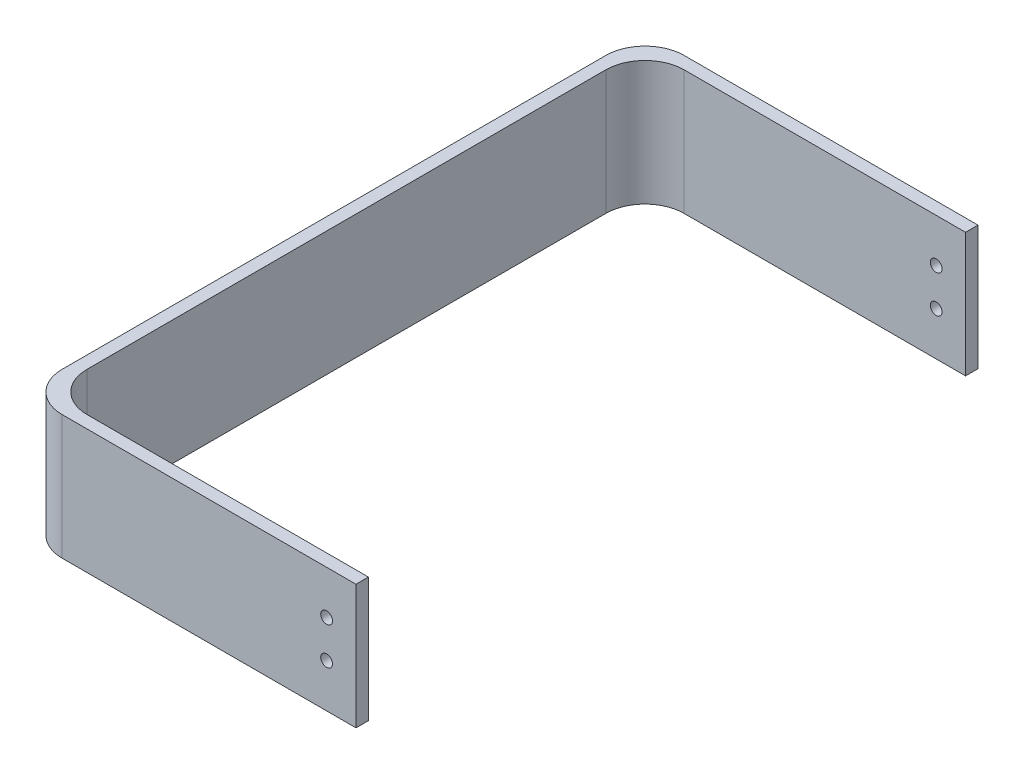
ISO-10303-21;
HEADER;
FILE_DESCRIPTION(('STEP AP214'),'2;1');
FILE_NAME('part.step','',(''),(''),'','','');
FILE_SCHEMA(('AUTOMOTIVE_DESIGN { 1 0 10303 214 1 1 1 1 }'));
ENDSEC;
DATA;
#1=APPLICATION_CONTEXT('core data for automotive mechanical design processes');
#2=APPLICATION_PROTOCOL_DEFINITION('international standard','automotive_design',2000,#1);
#3=PRODUCT_CONTEXT('',#1,'mechanical');
#4=PRODUCT('Part','Part','',(#3));
#5=PRODUCT_RELATED_PRODUCT_CATEGORY('part','',(#4));
#6=PRODUCT_DEFINITION_FORMATION('','',#4);
#7=PRODUCT_DEFINITION_CONTEXT('part definition',#1,'design');
#8=PRODUCT_DEFINITION('design','',#6,#7);
#9=PRODUCT_DEFINITION_SHAPE('','',#8);
#10=(LENGTH_UNIT() NAMED_UNIT(*) SI_UNIT(.MILLI.,.METRE.));
#11=(NAMED_UNIT(*) PLANE_ANGLE_UNIT() SI_UNIT($,.RADIAN.));
#12=(NAMED_UNIT(*) SI_UNIT($,.STERADIAN.) SOLID_ANGLE_UNIT());
#13=UNCERTAINTY_MEASURE_WITH_UNIT(LENGTH_MEASURE(1.E-05),#10,'distance_accuracy_value','');
#14=(GEOMETRIC_REPRESENTATION_CONTEXT(3) GLOBAL_UNCERTAINTY_ASSIGNED_CONTEXT((#13)) GLOBAL_UNIT_ASSIGNED_CONTEXT((#10,
#11,#12)) REPRESENTATION_CONTEXT('',''));
#15=CARTESIAN_POINT('',(0.,0.,0.));
#16=DIRECTION('',(0.,0.,1.));
#17=DIRECTION('',(1.,0.,0.));
#18=AXIS2_PLACEMENT_3D('',#15,#16,#17);
#19=CARTESIAN_POINT('',(0.,31.75,-3.175));
#20=DIRECTION('',(-1.,0.,0.));
#21=DIRECTION('',(0.,0.,1.));
#22=AXIS2_PLACEMENT_3D('',#19,#20,#21);
#23=PLANE('',#22);
#24=DIRECTION('',(0.,0.,-1.));
#25=VECTOR('',#24,1.);
#26=CARTESIAN_POINT('',(0.,0.,-3.175));
#27=LINE('',#26,#25);
#28=CARTESIAN_POINT('',(0.,0.,0.));
#29=VERTEX_POINT('',#28);
#30=CARTESIAN_POINT('',(0.,0.,-3.175));
#31=VERTEX_POINT('',#30);
#32=EDGE_CURVE('E160',#29,#31,#27,.T.);
#33=ORIENTED_EDGE('',*,*,#32,.T.);
#34=DIRECTION('',(0.,-1.,0.));
#35=VECTOR('',#34,1.);
#36=CARTESIAN_POINT('',(0.,31.75,-3.175));
#37=LINE('',#36,#35);
#38=CARTESIAN_POINT('',(0.,31.75,-3.175));
#39=VERTEX_POINT('',#38);
#40=EDGE_CURVE('E141',#39,#31,#37,.T.);
#41=ORIENTED_EDGE('',*,*,#40,.F.);
#42=DIRECTION('',(0.,0.,-1.));
#43=VECTOR('',#42,1.);
#44=CARTESIAN_POINT('',(0.,31.75,-3.175));
#45=LINE('',#44,#43);
#46=CARTESIAN_POINT('',(0.,31.75,0.));
#47=VERTEX_POINT('',#46);
#48=EDGE_CURVE('E148',#47,#39,#45,.T.);
#49=ORIENTED_EDGE('',*,*,#48,.F.);
#50=DIRECTION('',(0.,-1.,0.));
#51=VECTOR('',#50,1.);
#52=CARTESIAN_POINT('',(0.,31.75,0.));
#53=LINE('',#52,#51);
#54=EDGE_CURVE('E257',#47,#29,#53,.T.);
#55=ORIENTED_EDGE('',*,*,#54,.T.);
#56=EDGE_LOOP('',(#33,#41,#49,#55));
#57=FACE_BOUND('',#56,.T.);
#58=ADVANCED_FACE('F44',(#57),#23,.F.);
#59=CARTESIAN_POINT('',(0.,31.75,-3.175));
#60=DIRECTION('',(0.,0.,1.));
#61=DIRECTION('',(1.,0.,0.));
#62=AXIS2_PLACEMENT_3D('',#59,#60,#61);
#63=PLANE('',#62);
#64=CARTESIAN_POINT('',(-7.49999999999999,11.1125,-3.17500000000001));
#65=DIRECTION('',(0.,0.,1.));
#66=DIRECTION('',(1.,0.,0.));
#67=AXIS2_PLACEMENT_3D('',#64,#65,#66);
#68=CIRCLE('',#67,1.5);
#69=CARTESIAN_POINT('',(-5.99999999999999,11.1125,-3.17500000000001));
#70=VERTEX_POINT('',#69);
#71=EDGE_CURVE('E260',#70,#70,#68,.T.);
#72=ORIENTED_EDGE('',*,*,#71,.T.);
#73=EDGE_LOOP('',(#72));
#74=FACE_BOUND('',#73,.T.);
#75=CARTESIAN_POINT('',(-7.49999999999999,20.6375,-3.17500000000001));
#76=DIRECTION('',(0.,0.,1.));
#77=DIRECTION('',(1.,0.,0.));
#78=AXIS2_PLACEMENT_3D('',#75,#76,#77);
#79=CIRCLE('',#78,1.5);
#80=CARTESIAN_POINT('',(-5.99999999999999,20.6375,-3.17500000000001));
#81=VERTEX_POINT('',#80);
#82=EDGE_CURVE('E359',#81,#81,#79,.T.);
#83=ORIENTED_EDGE('',*,*,#82,.T.);
#84=EDGE_LOOP('',(#83));
#85=FACE_BOUND('',#84,.T.);
#86=DIRECTION('',(-1.,0.,0.));
#87=VECTOR('',#86,1.);
#88=CARTESIAN_POINT('',(0.,0.,-3.175));
#89=LINE('',#88,#87);
#90=CARTESIAN_POINT('',(-71.825,0.,-3.17499999999999));
#91=VERTEX_POINT('',#90);
#92=EDGE_CURVE('E231',#31,#91,#89,.T.);
#93=ORIENTED_EDGE('',*,*,#92,.T.);
#94=DIRECTION('',(0.,-1.,0.));
#95=VECTOR('',#94,1.);
#96=CARTESIAN_POINT('',(-71.825,31.75,-3.17499999999999));
#97=LINE('',#96,#95);
#98=CARTESIAN_POINT('',(-71.825,31.75,-3.17499999999999));
#99=VERTEX_POINT('',#98);
#100=EDGE_CURVE('E144',#91,#99,#97,.F.);
#101=ORIENTED_EDGE('',*,*,#100,.T.);
#102=DIRECTION('',(-1.,0.,0.));
#103=VECTOR('',#102,1.);
#104=CARTESIAN_POINT('',(0.,31.75,-3.175));
#105=LINE('',#104,#103);
#106=EDGE_CURVE('E136',#39,#99,#105,.T.);
#107=ORIENTED_EDGE('',*,*,#106,.F.);
#108=ORIENTED_EDGE('',*,*,#40,.T.);
#109=EDGE_LOOP('',(#93,#101,#107,#108));
#110=FACE_BOUND('',#109,.T.);
#111=ADVANCED_FACE('F139',(#74,#85,#110),#63,.F.);
#112=CARTESIAN_POINT('',(-81.825,31.75,-3.17499999999999));
#113=DIRECTION('',(-1.,0.,0.));
#114=DIRECTION('',(0.,0.,1.));
#115=AXIS2_PLACEMENT_3D('',#112,#113,#114);
#116=PLANE('',#115);
#117=DIRECTION('',(0.,0.,-1.));
#118=VECTOR('',#117,1.);
#119=CARTESIAN_POINT('',(-81.825,31.75,-3.17499999999999));
#120=LINE('',#119,#118);
#121=CARTESIAN_POINT('',(-81.825,31.75,-13.175));
#122=VERTEX_POINT('',#121);
#123=CARTESIAN_POINT('',(-81.825,31.75,-145.575));
#124=VERTEX_POINT('',#123);
#125=EDGE_CURVE('E147',#122,#124,#120,.T.);
#126=ORIENTED_EDGE('',*,*,#125,.F.);
#127=DIRECTION('',(0.,-1.,0.));
#128=VECTOR('',#127,1.);
#129=CARTESIAN_POINT('',(-81.825,0.,-13.175));
#130=LINE('',#129,#128);
#131=CARTESIAN_POINT('',(-81.825,0.,-13.175));
#132=VERTEX_POINT('',#131);
#133=EDGE_CURVE('E167',#122,#132,#130,.T.);
#134=ORIENTED_EDGE('',*,*,#133,.T.);
#135=DIRECTION('',(0.,0.,-1.));
#136=VECTOR('',#135,1.);
#137=CARTESIAN_POINT('',(-81.825,0.,-3.17499999999999));
#138=LINE('',#137,#136);
#139=CARTESIAN_POINT('',(-81.825,0.,-145.575));
#140=VERTEX_POINT('',#139);
#141=EDGE_CURVE('E219',#132,#140,#138,.T.);
#142=ORIENTED_EDGE('',*,*,#141,.T.);
#143=DIRECTION('',(0.,-1.,0.));
#144=VECTOR('',#143,1.);
#145=CARTESIAN_POINT('',(-81.825,31.75,-145.575));
#146=LINE('',#145,#144);
#147=EDGE_CURVE('E162',#140,#124,#146,.F.);
#148=ORIENTED_EDGE('',*,*,#147,.T.);
#149=EDGE_LOOP('',(#126,#134,#142,#148));
#150=FACE_BOUND('',#149,.T.);
#151=ADVANCED_FACE('F227',(#150),#116,.F.);
#152=CARTESIAN_POINT('',(-81.825,31.75,-155.575));
#153=DIRECTION('',(0.,0.,-1.));
#154=DIRECTION('',(-1.,0.,0.));
#155=AXIS2_PLACEMENT_3D('',#152,#153,#154);
#156=PLANE('',#155);
#157=CARTESIAN_POINT('',(-7.49999999999999,11.1125,-155.575));
#158=DIRECTION('',(0.,0.,-1.));
#159=DIRECTION('',(-1.,0.,0.));
#160=AXIS2_PLACEMENT_3D('',#157,#158,#159);
#161=CIRCLE('',#160,1.5);
#162=CARTESIAN_POINT('',(-5.99999999999999,11.1125,-155.575));
#163=VERTEX_POINT('',#162);
#164=EDGE_CURVE('E355',#163,#163,#161,.T.);
#165=ORIENTED_EDGE('',*,*,#164,.T.);
#166=EDGE_LOOP('',(#165));
#167=FACE_BOUND('',#166,.T.);
#168=CARTESIAN_POINT('',(-7.49999999999999,20.6375,-155.575));
#169=DIRECTION('',(0.,0.,-1.));
#170=DIRECTION('',(-1.,0.,0.));
#171=AXIS2_PLACEMENT_3D('',#168,#169,#170);
#172=CIRCLE('',#171,1.5);
#173=CARTESIAN_POINT('',(-5.99999999999999,20.6375,-155.575));
#174=VERTEX_POINT('',#173);
#175=EDGE_CURVE('E365',#174,#174,#172,.T.);
#176=ORIENTED_EDGE('',*,*,#175,.T.);
#177=EDGE_LOOP('',(#176));
#178=FACE_BOUND('',#177,.T.);
#179=DIRECTION('',(1.,0.,0.));
#180=VECTOR('',#179,1.);
#181=CARTESIAN_POINT('',(-81.825,31.75,-155.575));
#182=LINE('',#181,#180);
#183=CARTESIAN_POINT('',(-71.825,31.75,-155.575));
#184=VERTEX_POINT('',#183);
#185=CARTESIAN_POINT('',(0.,31.75,-155.575));
#186=VERTEX_POINT('',#185);
#187=EDGE_CURVE('E236',#184,#186,#182,.T.);
#188=ORIENTED_EDGE('',*,*,#187,.F.);
#189=DIRECTION('',(0.,-1.,0.));
#190=VECTOR('',#189,1.);
#191=CARTESIAN_POINT('',(-71.825,0.,-155.575));
#192=LINE('',#191,#190);
#193=CARTESIAN_POINT('',(-71.825,0.,-155.575));
#194=VERTEX_POINT('',#193);
#195=EDGE_CURVE('E179',#184,#194,#192,.T.);
#196=ORIENTED_EDGE('',*,*,#195,.T.);
#197=DIRECTION('',(1.,0.,0.));
#198=VECTOR('',#197,1.);
#199=CARTESIAN_POINT('',(-81.825,0.,-155.575));
#200=LINE('',#199,#198);
#201=CARTESIAN_POINT('',(0.,0.,-155.575));
#202=VERTEX_POINT('',#201);
#203=EDGE_CURVE('E221',#194,#202,#200,.T.);
#204=ORIENTED_EDGE('',*,*,#203,.T.);
#205=DIRECTION('',(0.,-1.,0.));
#206=VECTOR('',#205,1.);
#207=CARTESIAN_POINT('',(0.,31.75,-155.575));
#208=LINE('',#207,#206);
#209=EDGE_CURVE('E163',#186,#202,#208,.T.);
#210=ORIENTED_EDGE('',*,*,#209,.F.);
#211=EDGE_LOOP('',(#188,#196,#204,#210));
#212=FACE_BOUND('',#211,.T.);
#213=ADVANCED_FACE('F239',(#167,#178,#212),#156,.F.);
#214=CARTESIAN_POINT('',(0.,31.75,-158.75));
#215=DIRECTION('',(-1.,0.,0.));
#216=DIRECTION('',(0.,0.,1.));
#217=AXIS2_PLACEMENT_3D('',#214,#215,#216);
#218=PLANE('',#217);
#219=DIRECTION('',(0.,0.,-1.));
#220=VECTOR('',#219,1.);
#221=CARTESIAN_POINT('',(0.,0.,-158.75));
#222=LINE('',#221,#220);
#223=CARTESIAN_POINT('',(0.,0.,-158.75));
#224=VERTEX_POINT('',#223);
#225=EDGE_CURVE('E265',#202,#224,#222,.T.);
#226=ORIENTED_EDGE('',*,*,#225,.T.);
#227=DIRECTION('',(0.,-1.,0.));
#228=VECTOR('',#227,1.);
#229=CARTESIAN_POINT('',(0.,31.75,-158.75));
#230=LINE('',#229,#228);
#231=CARTESIAN_POINT('',(0.,31.75,-158.75));
#232=VERTEX_POINT('',#231);
#233=EDGE_CURVE('E170',#232,#224,#230,.T.);
#234=ORIENTED_EDGE('',*,*,#233,.F.);
#235=DIRECTION('',(0.,0.,-1.));
#236=VECTOR('',#235,1.);
#237=CARTESIAN_POINT('',(0.,31.75,-158.75));
#238=LINE('',#237,#236);
#239=EDGE_CURVE('E242',#186,#232,#238,.T.);
#240=ORIENTED_EDGE('',*,*,#239,.F.);
#241=ORIENTED_EDGE('',*,*,#209,.T.);
#242=EDGE_LOOP('',(#226,#234,#240,#241));
#243=FACE_BOUND('',#242,.T.);
#244=ADVANCED_FACE('F325',(#243),#218,.F.);
#245=CARTESIAN_POINT('',(-85.,31.75,-158.75));
#246=DIRECTION('',(0.,0.,1.));
#247=DIRECTION('',(1.,0.,0.));
#248=AXIS2_PLACEMENT_3D('',#245,#246,#247);
#249=PLANE('',#248);
#250=CARTESIAN_POINT('',(-7.49999999999999,11.1125,-158.75));
#251=DIRECTION('',(0.,0.,1.));
#252=DIRECTION('',(1.,0.,0.));
#253=AXIS2_PLACEMENT_3D('',#250,#251,#252);
#254=CIRCLE('',#253,1.5);
#255=CARTESIAN_POINT('',(-5.99999999999999,11.1125,-158.75));
#256=VERTEX_POINT('',#255);
#257=EDGE_CURVE('E369',#256,#256,#254,.T.);
#258=ORIENTED_EDGE('',*,*,#257,.T.);
#259=EDGE_LOOP('',(#258));
#260=FACE_BOUND('',#259,.T.);
#261=CARTESIAN_POINT('',(-7.49999999999999,20.6375,-158.75));
#262=DIRECTION('',(0.,0.,1.));
#263=DIRECTION('',(1.,0.,0.));
#264=AXIS2_PLACEMENT_3D('',#261,#262,#263);
#265=CIRCLE('',#264,1.5);
#266=CARTESIAN_POINT('',(-5.99999999999999,20.6375,-158.75));
#267=VERTEX_POINT('',#266);
#268=EDGE_CURVE('E370',#267,#267,#265,.T.);
#269=ORIENTED_EDGE('',*,*,#268,.T.);
#270=EDGE_LOOP('',(#269));
#271=FACE_BOUND('',#270,.T.);
#272=DIRECTION('',(-1.,0.,0.));
#273=VECTOR('',#272,1.);
#274=CARTESIAN_POINT('',(-85.,0.,-158.75));
#275=LINE('',#274,#273);
#276=CARTESIAN_POINT('',(-75.,0.,-158.75));
#277=VERTEX_POINT('',#276);
#278=EDGE_CURVE('E268',#224,#277,#275,.T.);
#279=ORIENTED_EDGE('',*,*,#278,.T.);
#280=DIRECTION('',(0.,-1.,0.));
#281=VECTOR('',#280,1.);
#282=CARTESIAN_POINT('',(-75.,31.75,-158.75));
#283=LINE('',#282,#281);
#284=CARTESIAN_POINT('',(-75.,31.75,-158.75));
#285=VERTEX_POINT('',#284);
#286=EDGE_CURVE('E68',#277,#285,#283,.F.);
#287=ORIENTED_EDGE('',*,*,#286,.T.);
#288=DIRECTION('',(-1.,0.,0.));
#289=VECTOR('',#288,1.);
#290=CARTESIAN_POINT('',(-85.,31.75,-158.75));
#291=LINE('',#290,#289);
#292=EDGE_CURVE('E246',#232,#285,#291,.T.);
#293=ORIENTED_EDGE('',*,*,#292,.F.);
#294=ORIENTED_EDGE('',*,*,#233,.T.);
#295=EDGE_LOOP('',(#279,#287,#293,#294));
#296=FACE_BOUND('',#295,.T.);
#297=ADVANCED_FACE('F282',(#260,#271,#296),#249,.F.);
#298=CARTESIAN_POINT('',(-85.,31.75,0.));
#299=DIRECTION('',(1.,0.,0.));
#300=DIRECTION('',(0.,0.,-1.));
#301=AXIS2_PLACEMENT_3D('',#298,#299,#300);
#302=PLANE('',#301);
#303=DIRECTION('',(0.,0.,1.));
#304=VECTOR('',#303,1.);
#305=CARTESIAN_POINT('',(-85.,31.75,0.));
#306=LINE('',#305,#304);
#307=CARTESIAN_POINT('',(-85.,31.75,-148.75));
#308=VERTEX_POINT('',#307);
#309=CARTESIAN_POINT('',(-85.,31.75,-9.99999999999999));
#310=VERTEX_POINT('',#309);
#311=EDGE_CURVE('E252',#308,#310,#306,.T.);
#312=ORIENTED_EDGE('',*,*,#311,.F.);
#313=DIRECTION('',(0.,-1.,0.));
#314=VECTOR('',#313,1.);
#315=CARTESIAN_POINT('',(-85.,31.75,-148.75));
#316=LINE('',#315,#314);
#317=CARTESIAN_POINT('',(-85.,0.,-148.75));
#318=VERTEX_POINT('',#317);
#319=EDGE_CURVE('E186',#308,#318,#316,.T.);
#320=ORIENTED_EDGE('',*,*,#319,.T.);
#321=DIRECTION('',(0.,0.,1.));
#322=VECTOR('',#321,1.);
#323=CARTESIAN_POINT('',(-85.,0.,0.));
#324=LINE('',#323,#322);
#325=CARTESIAN_POINT('',(-85.,0.,-9.99999999999999));
#326=VERTEX_POINT('',#325);
#327=EDGE_CURVE('E271',#318,#326,#324,.T.);
#328=ORIENTED_EDGE('',*,*,#327,.T.);
#329=DIRECTION('',(0.,-1.,0.));
#330=VECTOR('',#329,1.);
#331=CARTESIAN_POINT('',(-85.,31.75,-9.99999999999999));
#332=LINE('',#331,#330);
#333=EDGE_CURVE('E183',#326,#310,#332,.F.);
#334=ORIENTED_EDGE('',*,*,#333,.T.);
#335=EDGE_LOOP('',(#312,#320,#328,#334));
#336=FACE_BOUND('',#335,.T.);
#337=ADVANCED_FACE('F290',(#336),#302,.F.);
#338=CARTESIAN_POINT('',(0.,31.75,0.));
#339=DIRECTION('',(0.,0.,-1.));
#340=DIRECTION('',(-1.,0.,0.));
#341=AXIS2_PLACEMENT_3D('',#338,#339,#340);
#342=PLANE('',#341);
#343=CARTESIAN_POINT('',(-7.49999999999999,11.1125,0.));
#344=DIRECTION('',(0.,0.,1.));
#345=DIRECTION('',(1.,0.,0.));
#346=AXIS2_PLACEMENT_3D('',#343,#344,#345);
#347=CIRCLE('',#346,1.5);
#348=CARTESIAN_POINT('',(-5.99999999999999,11.1125,0.));
#349=VERTEX_POINT('',#348);
#350=EDGE_CURVE('E351',#349,#349,#347,.T.);
#351=ORIENTED_EDGE('',*,*,#350,.F.);
#352=EDGE_LOOP('',(#351));
#353=FACE_BOUND('',#352,.T.);
#354=CARTESIAN_POINT('',(-7.49999999999999,20.6375,0.));
#355=DIRECTION('',(0.,0.,1.));
#356=DIRECTION('',(1.,0.,0.));
#357=AXIS2_PLACEMENT_3D('',#354,#355,#356);
#358=CIRCLE('',#357,1.5);
#359=CARTESIAN_POINT('',(-5.99999999999999,20.6375,0.));
#360=VERTEX_POINT('',#359);
#361=EDGE_CURVE('E374',#360,#360,#358,.T.);
#362=ORIENTED_EDGE('',*,*,#361,.F.);
#363=EDGE_LOOP('',(#362));
#364=FACE_BOUND('',#363,.T.);
#365=DIRECTION('',(1.,0.,0.));
#366=VECTOR('',#365,1.);
#367=CARTESIAN_POINT('',(0.,31.75,0.));
#368=LINE('',#367,#366);
#369=CARTESIAN_POINT('',(-75.,31.75,0.));
#370=VERTEX_POINT('',#369);
#371=EDGE_CURVE('E152',#370,#47,#368,.T.);
#372=ORIENTED_EDGE('',*,*,#371,.F.);
#373=DIRECTION('',(0.,-1.,0.));
#374=VECTOR('',#373,1.);
#375=CARTESIAN_POINT('',(-75.,31.75,0.));
#376=LINE('',#375,#374);
#377=CARTESIAN_POINT('',(-75.,0.,0.));
#378=VERTEX_POINT('',#377);
#379=EDGE_CURVE('E203',#370,#378,#376,.T.);
#380=ORIENTED_EDGE('',*,*,#379,.T.);
#381=DIRECTION('',(1.,0.,0.));
#382=VECTOR('',#381,1.);
#383=CARTESIAN_POINT('',(0.,0.,0.));
#384=LINE('',#383,#382);
#385=EDGE_CURVE('E157',#378,#29,#384,.T.);
#386=ORIENTED_EDGE('',*,*,#385,.T.);
#387=ORIENTED_EDGE('',*,*,#54,.F.);
#388=EDGE_LOOP('',(#372,#380,#386,#387));
#389=FACE_BOUND('',#388,.T.);
#390=ADVANCED_FACE('F296',(#353,#364,#389),#342,.F.);
#391=CARTESIAN_POINT('',(0.,31.75,0.));
#392=DIRECTION('',(0.,-1.,0.));
#393=DIRECTION('',(0.,0.,-1.));
#394=AXIS2_PLACEMENT_3D('',#391,#392,#393);
#395=PLANE('',#394);
#396=ORIENTED_EDGE('',*,*,#292,.T.);
#397=CARTESIAN_POINT('',(-75.,31.75,-148.75));
#398=DIRECTION('',(0.,-1.,0.));
#399=DIRECTION('',(0.,0.,-1.));
#400=AXIS2_PLACEMENT_3D('',#397,#398,#399);
#401=CIRCLE('',#400,10.);
#402=EDGE_CURVE('E200',#285,#308,#401,.F.);
#403=ORIENTED_EDGE('',*,*,#402,.T.);
#404=ORIENTED_EDGE('',*,*,#311,.T.);
#405=CARTESIAN_POINT('',(-75.,31.75,-9.99999999999999));
#406=DIRECTION('',(0.,-1.,0.));
#407=DIRECTION('',(0.,0.,-1.));
#408=AXIS2_PLACEMENT_3D('',#405,#406,#407);
#409=CIRCLE('',#408,10.);
#410=EDGE_CURVE('E60',#310,#370,#409,.F.);
#411=ORIENTED_EDGE('',*,*,#410,.T.);
#412=ORIENTED_EDGE('',*,*,#371,.T.);
#413=ORIENTED_EDGE('',*,*,#48,.T.);
#414=ORIENTED_EDGE('',*,*,#106,.T.);
#415=CARTESIAN_POINT('',(-71.825,31.75,-13.175));
#416=DIRECTION('',(0.,-1.,0.));
#417=DIRECTION('',(0.,0.,-1.));
#418=AXIS2_PLACEMENT_3D('',#415,#416,#417);
#419=CIRCLE('',#418,10.);
#420=EDGE_CURVE('E210',#99,#122,#419,.T.);
#421=ORIENTED_EDGE('',*,*,#420,.T.);
#422=ORIENTED_EDGE('',*,*,#125,.T.);
#423=CARTESIAN_POINT('',(-71.825,31.75,-145.575));
#424=DIRECTION('',(0.,-1.,0.));
#425=DIRECTION('',(0.,0.,-1.));
#426=AXIS2_PLACEMENT_3D('',#423,#424,#425);
#427=CIRCLE('',#426,10.);
#428=EDGE_CURVE('E11',#124,#184,#427,.T.);
#429=ORIENTED_EDGE('',*,*,#428,.T.);
#430=ORIENTED_EDGE('',*,*,#187,.T.);
#431=ORIENTED_EDGE('',*,*,#239,.T.);
#432=EDGE_LOOP('',(#396,#403,#404,#411,#412,#413,#414,#421,#422,#429,#430,#431));
#433=FACE_BOUND('',#432,.T.);
#434=ADVANCED_FACE('F151',(#433),#395,.F.);
#435=CARTESIAN_POINT('',(0.,0.,0.));
#436=DIRECTION('',(0.,-1.,0.));
#437=DIRECTION('',(0.,0.,-1.));
#438=AXIS2_PLACEMENT_3D('',#435,#436,#437);
#439=PLANE('',#438);
#440=ORIENTED_EDGE('',*,*,#327,.F.);
#441=CARTESIAN_POINT('',(-75.,0.,-148.75));
#442=DIRECTION('',(0.,-1.,0.));
#443=DIRECTION('',(0.,0.,-1.));
#444=AXIS2_PLACEMENT_3D('',#441,#442,#443);
#445=CIRCLE('',#444,10.);
#446=EDGE_CURVE('E193',#318,#277,#445,.T.);
#447=ORIENTED_EDGE('',*,*,#446,.T.);
#448=ORIENTED_EDGE('',*,*,#278,.F.);
#449=ORIENTED_EDGE('',*,*,#225,.F.);
#450=ORIENTED_EDGE('',*,*,#203,.F.);
#451=CARTESIAN_POINT('',(-71.825,0.,-145.575));
#452=DIRECTION('',(0.,-1.,0.));
#453=DIRECTION('',(0.,0.,-1.));
#454=AXIS2_PLACEMENT_3D('',#451,#452,#453);
#455=CIRCLE('',#454,10.);
#456=EDGE_CURVE('E53',#194,#140,#455,.F.);
#457=ORIENTED_EDGE('',*,*,#456,.T.);
#458=ORIENTED_EDGE('',*,*,#141,.F.);
#459=CARTESIAN_POINT('',(-71.825,0.,-13.175));
#460=DIRECTION('',(0.,-1.,0.));
#461=DIRECTION('',(0.,0.,-1.));
#462=AXIS2_PLACEMENT_3D('',#459,#460,#461);
#463=CIRCLE('',#462,10.);
#464=EDGE_CURVE('E207',#132,#91,#463,.F.);
#465=ORIENTED_EDGE('',*,*,#464,.T.);
#466=ORIENTED_EDGE('',*,*,#92,.F.);
#467=ORIENTED_EDGE('',*,*,#32,.F.);
#468=ORIENTED_EDGE('',*,*,#385,.F.);
#469=CARTESIAN_POINT('',(-75.,0.,-9.99999999999999));
#470=DIRECTION('',(0.,-1.,0.));
#471=DIRECTION('',(0.,0.,-1.));
#472=AXIS2_PLACEMENT_3D('',#469,#470,#471);
#473=CIRCLE('',#472,10.);
#474=EDGE_CURVE('E190',#378,#326,#473,.T.);
#475=ORIENTED_EDGE('',*,*,#474,.T.);
#476=EDGE_LOOP('',(#440,#447,#448,#449,#450,#457,#458,#465,#466,#467,#468,#475));
#477=FACE_BOUND('',#476,.T.);
#478=ADVANCED_FACE('F218',(#477),#439,.T.);
#479=CARTESIAN_POINT('',(-7.49999999999999,20.6375,-158.75));
#480=DIRECTION('',(0.,0.,1.));
#481=DIRECTION('',(1.,0.,0.));
#482=AXIS2_PLACEMENT_3D('',#479,#480,#481);
#483=CYLINDRICAL_SURFACE('',#482,1.5);
#484=CARTESIAN_POINT('',(-5.99999999999999,20.6375,0.));
#485=CARTESIAN_POINT('',(-5.99999999999999,20.6375,-0.0330729166666914));
#486=CARTESIAN_POINT('',(-5.99999999999999,20.6375,-0.066145833333355));
#487=CARTESIAN_POINT('',(-5.99999999999999,20.6375,-0.132291666666691));
#488=CARTESIAN_POINT('',(-5.99999999999999,20.6375,-0.165364583333364));
#489=CARTESIAN_POINT('',(-5.99999999999999,20.6375,-0.231510416666701));
#490=CARTESIAN_POINT('',(-5.99999999999999,20.6375,-0.264583333333364));
#491=CARTESIAN_POINT('',(-5.99999999999999,20.6375,-0.330729166666692));
#492=CARTESIAN_POINT('',(-5.99999999999999,20.6375,-0.363802083333355));
#493=CARTESIAN_POINT('',(-5.99999999999999,20.6375,-0.429947916666692));
#494=CARTESIAN_POINT('',(-5.99999999999999,20.6375,-0.463020833333364));
#495=CARTESIAN_POINT('',(-5.99999999999999,20.6375,-0.529166666666701));
#496=CARTESIAN_POINT('',(-5.99999999999999,20.6375,-0.562239583333365));
#497=CARTESIAN_POINT('',(-5.99999999999999,20.6375,-0.628385416666692));
#498=CARTESIAN_POINT('',(-5.99999999999999,20.6375,-0.661458333333355));
#499=CARTESIAN_POINT('',(-5.99999999999999,20.6375,-0.727604166666682));
#500=CARTESIAN_POINT('',(-5.99999999999999,20.6375,-0.760677083333346));
#501=CARTESIAN_POINT('',(-5.99999999999999,20.6375,-0.826822916666683));
#502=CARTESIAN_POINT('',(-5.99999999999999,20.6375,-0.859895833333355));
#503=CARTESIAN_POINT('',(-5.99999999999999,20.6375,-0.926041666666692));
#504=CARTESIAN_POINT('',(-5.99999999999999,20.6375,-0.959114583333356));
#505=CARTESIAN_POINT('',(-5.99999999999999,20.6375,-1.02526041666668));
#506=CARTESIAN_POINT('',(-5.99999999999999,20.6375,-1.05833333333335));
#507=CARTESIAN_POINT('',(-5.99999999999999,20.6375,-1.12447916666668));
#508=CARTESIAN_POINT('',(-5.99999999999999,20.6375,-1.15755208333336));
#509=CARTESIAN_POINT('',(-5.99999999999999,20.6375,-1.22369791666669));
#510=CARTESIAN_POINT('',(-5.99999999999999,20.6375,-1.25677083333336));
#511=CARTESIAN_POINT('',(-5.99999999999999,20.6375,-1.32291666666668));
#512=CARTESIAN_POINT('',(-5.99999999999999,20.6375,-1.35598958333335));
#513=CARTESIAN_POINT('',(-5.99999999999999,20.6375,-1.42213541666668));
#514=CARTESIAN_POINT('',(-5.99999999999999,20.6375,-1.45520833333336));
#515=CARTESIAN_POINT('',(-5.99999999999999,20.6375,-1.52135416666669));
#516=CARTESIAN_POINT('',(-5.99999999999999,20.6375,-1.55442708333336));
#517=CARTESIAN_POINT('',(-5.99999999999999,20.6375,-1.62057291666668));
#518=CARTESIAN_POINT('',(-5.99999999999999,20.6375,-1.65364583333335));
#519=CARTESIAN_POINT('',(-5.99999999999999,20.6375,-1.71979166666668));
#520=CARTESIAN_POINT('',(-5.99999999999999,20.6375,-1.75286458333336));
#521=CARTESIAN_POINT('',(-5.99999999999999,20.6375,-1.81901041666669));
#522=CARTESIAN_POINT('',(-5.99999999999999,20.6375,-1.85208333333336));
#523=CARTESIAN_POINT('',(-5.99999999999999,20.6375,-1.91822916666668));
#524=CARTESIAN_POINT('',(-5.99999999999999,20.6375,-1.95130208333335));
#525=CARTESIAN_POINT('',(-5.99999999999999,20.6375,-2.01744791666668));
#526=CARTESIAN_POINT('',(-5.99999999999999,20.6375,-2.05052083333336));
#527=CARTESIAN_POINT('',(-5.99999999999999,20.6375,-2.11666666666669));
#528=CARTESIAN_POINT('',(-5.99999999999999,20.6375,-2.14973958333336));
#529=CARTESIAN_POINT('',(-5.99999999999999,20.6375,-2.21588541666668));
#530=CARTESIAN_POINT('',(-5.99999999999999,20.6375,-2.24895833333335));
#531=CARTESIAN_POINT('',(-5.99999999999999,20.6375,-2.31510416666668));
#532=CARTESIAN_POINT('',(-5.99999999999999,20.6375,-2.34817708333336));
#533=CARTESIAN_POINT('',(-5.99999999999999,20.6375,-2.41432291666669));
#534=CARTESIAN_POINT('',(-5.99999999999999,20.6375,-2.44739583333336));
#535=CARTESIAN_POINT('',(-5.99999999999999,20.6375,-2.51354166666668));
#536=CARTESIAN_POINT('',(-5.99999999999999,20.6375,-2.54661458333335));
#537=CARTESIAN_POINT('',(-5.99999999999999,20.6375,-2.61276041666667));
#538=CARTESIAN_POINT('',(-5.99999999999999,20.6375,-2.64583333333334));
#539=CARTESIAN_POINT('',(-5.99999999999999,20.6375,-2.71197916666667));
#540=CARTESIAN_POINT('',(-5.99999999999999,20.6375,-2.74505208333335));
#541=CARTESIAN_POINT('',(-5.99999999999999,20.6375,-2.81119791666668));
#542=CARTESIAN_POINT('',(-5.99999999999999,20.6375,-2.84427083333335));
#543=CARTESIAN_POINT('',(-5.99999999999999,20.6375,-2.91041666666667));
#544=CARTESIAN_POINT('',(-5.99999999999999,20.6375,-2.94348958333334));
#545=CARTESIAN_POINT('',(-5.99999999999999,20.6375,-3.00963541666667));
#546=CARTESIAN_POINT('',(-5.99999999999999,20.6375,-3.04270833333335));
#547=CARTESIAN_POINT('',(-5.99999999999999,20.6375,-3.10885416666668));
#548=CARTESIAN_POINT('',(-5.99999999999999,20.6375,-3.14192708333335));
#549=CARTESIAN_POINT('',(-5.99999999999999,20.6375,-3.17500000000001));
#550=B_SPLINE_CURVE_WITH_KNOTS('',3,(#484,#485,#486,#487,#488,#489,#490,#491,#492,#493,#494,
#495,#496,#497,#498,#499,#500,#501,#502,#503,#504,#505,#506,#507,#508,#509,#510,#511,#512,#513,
#514,#515,#516,#517,#518,#519,#520,#521,#522,#523,#524,#525,#526,#527,#528,#529,#530,#531,#532,
#533,#534,#535,#536,#537,#538,#539,#540,#541,#542,#543,#544,#545,#546,#547,#548,#549),
.UNSPECIFIED.,.F.,.F.,(4,2,2,2,2,2,2,2,2,2,2,2,2,2,2,2,2,2,2,2,2,2,2,2,2,2,2,2,2,2,2,2,4),(0.,
0.0992187499999908,0.198437500000009,0.29765625,0.396874999999991,0.49609375000001,0.5953125,
0.694531249999991,0.793749999999982,0.892968750000001,0.992187499999991,1.09140624999998,
1.190625,1.28984374999999,1.38906249999998,1.48828125,1.58749999999999,1.68671874999998,
1.7859375,1.88515624999999,1.98437499999998,2.08359375,2.18281249999999,2.28203124999998,
2.38125,2.48046874999999,2.57968749999998,2.67890624999997,2.77812499999999,2.87734374999998,
2.97656249999997,3.07578124999999,3.17499999999998),.UNSPECIFIED.);
#551=EDGE_CURVE('BSEAM337',#360,#81,#550,.T.);
#552=ORIENTED_EDGE('',*,*,#361,.T.);
#553=ORIENTED_EDGE('',*,*,#82,.F.);
#554=ORIENTED_EDGE('',*,*,#551,.T.);
#555=ORIENTED_EDGE('',*,*,#551,.F.);
#556=EDGE_LOOP('',(#552,#554,#553,#555));
#557=FACE_BOUND('',#556,.T.);
#558=ADVANCED_FACE('F337',(#557),#483,.F.);
#559=CARTESIAN_POINT('',(-7.49999999999999,11.1125,-158.75));
#560=DIRECTION('',(0.,0.,1.));
#561=DIRECTION('',(1.,0.,0.));
#562=AXIS2_PLACEMENT_3D('',#559,#560,#561);
#563=CYLINDRICAL_SURFACE('',#562,1.5);
#564=CARTESIAN_POINT('',(-5.99999999999999,11.1125,0.));
#565=CARTESIAN_POINT('',(-5.99999999999999,11.1125,-0.0330729166666914));
#566=CARTESIAN_POINT('',(-5.99999999999999,11.1125,-0.066145833333355));
#567=CARTESIAN_POINT('',(-5.99999999999999,11.1125,-0.132291666666691));
#568=CARTESIAN_POINT('',(-5.99999999999999,11.1125,-0.165364583333364));
#569=CARTESIAN_POINT('',(-5.99999999999999,11.1125,-0.231510416666701));
#570=CARTESIAN_POINT('',(-5.99999999999999,11.1125,-0.264583333333364));
#571=CARTESIAN_POINT('',(-5.99999999999999,11.1125,-0.330729166666692));
#572=CARTESIAN_POINT('',(-5.99999999999999,11.1125,-0.363802083333355));
#573=CARTESIAN_POINT('',(-5.99999999999999,11.1125,-0.429947916666692));
#574=CARTESIAN_POINT('',(-5.99999999999999,11.1125,-0.463020833333364));
#575=CARTESIAN_POINT('',(-5.99999999999999,11.1125,-0.529166666666701));
#576=CARTESIAN_POINT('',(-5.99999999999999,11.1125,-0.562239583333365));
#577=CARTESIAN_POINT('',(-5.99999999999999,11.1125,-0.628385416666692));
#578=CARTESIAN_POINT('',(-5.99999999999999,11.1125,-0.661458333333355));
#579=CARTESIAN_POINT('',(-5.99999999999999,11.1125,-0.727604166666682));
#580=CARTESIAN_POINT('',(-5.99999999999999,11.1125,-0.760677083333346));
#581=CARTESIAN_POINT('',(-5.99999999999999,11.1125,-0.826822916666683));
#582=CARTESIAN_POINT('',(-5.99999999999999,11.1125,-0.859895833333355));
#583=CARTESIAN_POINT('',(-5.99999999999999,11.1125,-0.926041666666692));
#584=CARTESIAN_POINT('',(-5.99999999999999,11.1125,-0.959114583333356));
#585=CARTESIAN_POINT('',(-5.99999999999999,11.1125,-1.02526041666668));
#586=CARTESIAN_POINT('',(-5.99999999999999,11.1125,-1.05833333333335));
#587=CARTESIAN_POINT('',(-5.99999999999999,11.1125,-1.12447916666668));
#588=CARTESIAN_POINT('',(-5.99999999999999,11.1125,-1.15755208333336));
#589=CARTESIAN_POINT('',(-5.99999999999999,11.1125,-1.22369791666669));
#590=CARTESIAN_POINT('',(-5.99999999999999,11.1125,-1.25677083333336));
#591=CARTESIAN_POINT('',(-5.99999999999999,11.1125,-1.32291666666668));
#592=CARTESIAN_POINT('',(-5.99999999999999,11.1125,-1.35598958333335));
#593=CARTESIAN_POINT('',(-5.99999999999999,11.1125,-1.42213541666668));
#594=CARTESIAN_POINT('',(-5.99999999999999,11.1125,-1.45520833333336));
#595=CARTESIAN_POINT('',(-5.99999999999999,11.1125,-1.52135416666669));
#596=CARTESIAN_POINT('',(-5.99999999999999,11.1125,-1.55442708333336));
#597=CARTESIAN_POINT('',(-5.99999999999999,11.1125,-1.62057291666668));
#598=CARTESIAN_POINT('',(-5.99999999999999,11.1125,-1.65364583333335));
#599=CARTESIAN_POINT('',(-5.99999999999999,11.1125,-1.71979166666668));
#600=CARTESIAN_POINT('',(-5.99999999999999,11.1125,-1.75286458333336));
#601=CARTESIAN_POINT('',(-5.99999999999999,11.1125,-1.81901041666669));
#602=CARTESIAN_POINT('',(-5.99999999999999,11.1125,-1.85208333333336));
#603=CARTESIAN_POINT('',(-5.99999999999999,11.1125,-1.91822916666668));
#604=CARTESIAN_POINT('',(-5.99999999999999,11.1125,-1.95130208333335));
#605=CARTESIAN_POINT('',(-5.99999999999999,11.1125,-2.01744791666668));
#606=CARTESIAN_POINT('',(-5.99999999999999,11.1125,-2.05052083333336));
#607=CARTESIAN_POINT('',(-5.99999999999999,11.1125,-2.11666666666669));
#608=CARTESIAN_POINT('',(-5.99999999999999,11.1125,-2.14973958333336));
#609=CARTESIAN_POINT('',(-5.99999999999999,11.1125,-2.21588541666668));
#610=CARTESIAN_POINT('',(-5.99999999999999,11.1125,-2.24895833333335));
#611=CARTESIAN_POINT('',(-5.99999999999999,11.1125,-2.31510416666668));
#612=CARTESIAN_POINT('',(-5.99999999999999,11.1125,-2.34817708333336));
#613=CARTESIAN_POINT('',(-5.99999999999999,11.1125,-2.41432291666669));
#614=CARTESIAN_POINT('',(-5.99999999999999,11.1125,-2.44739583333336));
#615=CARTESIAN_POINT('',(-5.99999999999999,11.1125,-2.51354166666668));
#616=CARTESIAN_POINT('',(-5.99999999999999,11.1125,-2.54661458333335));
#617=CARTESIAN_POINT('',(-5.99999999999999,11.1125,-2.61276041666667));
#618=CARTESIAN_POINT('',(-5.99999999999999,11.1125,-2.64583333333334));
#619=CARTESIAN_POINT('',(-5.99999999999999,11.1125,-2.71197916666667));
#620=CARTESIAN_POINT('',(-5.99999999999999,11.1125,-2.74505208333335));
#621=CARTESIAN_POINT('',(-5.99999999999999,11.1125,-2.81119791666668));
#622=CARTESIAN_POINT('',(-5.99999999999999,11.1125,-2.84427083333335));
#623=CARTESIAN_POINT('',(-5.99999999999999,11.1125,-2.91041666666667));
#624=CARTESIAN_POINT('',(-5.99999999999999,11.1125,-2.94348958333334));
#625=CARTESIAN_POINT('',(-5.99999999999999,11.1125,-3.00963541666667));
#626=CARTESIAN_POINT('',(-5.99999999999999,11.1125,-3.04270833333335));
#627=CARTESIAN_POINT('',(-5.99999999999999,11.1125,-3.10885416666668));
#628=CARTESIAN_POINT('',(-5.99999999999999,11.1125,-3.14192708333335));
#629=CARTESIAN_POINT('',(-5.99999999999999,11.1125,-3.17500000000001));
#630=B_SPLINE_CURVE_WITH_KNOTS('',3,(#564,#565,#566,#567,#568,#569,#570,#571,#572,#573,#574,
#575,#576,#577,#578,#579,#580,#581,#582,#583,#584,#585,#586,#587,#588,#589,#590,#591,#592,#593,
#594,#595,#596,#597,#598,#599,#600,#601,#602,#603,#604,#605,#606,#607,#608,#609,#610,#611,#612,
#613,#614,#615,#616,#617,#618,#619,#620,#621,#622,#623,#624,#625,#626,#627,#628,#629),
.UNSPECIFIED.,.F.,.F.,(4,2,2,2,2,2,2,2,2,2,2,2,2,2,2,2,2,2,2,2,2,2,2,2,2,2,2,2,2,2,2,2,4),(0.,
0.0992187499999908,0.198437500000009,0.29765625,0.396874999999991,0.49609375000001,0.5953125,
0.694531249999991,0.793749999999982,0.892968750000001,0.992187499999991,1.09140624999998,
1.190625,1.28984374999999,1.38906249999998,1.48828125,1.58749999999999,1.68671874999998,
1.7859375,1.88515624999999,1.98437499999998,2.08359375,2.18281249999999,2.28203124999998,
2.38125,2.48046874999999,2.57968749999998,2.67890624999997,2.77812499999999,2.87734374999998,
2.97656249999997,3.07578124999999,3.17499999999998),.UNSPECIFIED.);
#631=EDGE_CURVE('BSEAM311',#349,#70,#630,.T.);
#632=ORIENTED_EDGE('',*,*,#350,.T.);
#633=ORIENTED_EDGE('',*,*,#71,.F.);
#634=ORIENTED_EDGE('',*,*,#631,.T.);
#635=ORIENTED_EDGE('',*,*,#631,.F.);
#636=EDGE_LOOP('',(#632,#634,#633,#635));
#637=FACE_BOUND('',#636,.T.);
#638=ADVANCED_FACE('F311',(#637),#563,.F.);
#639=CARTESIAN_POINT('',(-5.99999999999999,20.6375,-158.75));
#640=CARTESIAN_POINT('',(-5.99999999999999,20.6375,-158.716927083333));
#641=CARTESIAN_POINT('',(-5.99999999999999,20.6375,-158.683854166667));
#642=CARTESIAN_POINT('',(-5.99999999999999,20.6375,-158.617708333333));
#643=CARTESIAN_POINT('',(-5.99999999999999,20.6375,-158.584635416667));
#644=CARTESIAN_POINT('',(-5.99999999999999,20.6375,-158.518489583333));
#645=CARTESIAN_POINT('',(-5.99999999999999,20.6375,-158.485416666667));
#646=CARTESIAN_POINT('',(-5.99999999999999,20.6375,-158.419270833333));
#647=CARTESIAN_POINT('',(-5.99999999999999,20.6375,-158.386197916667));
#648=CARTESIAN_POINT('',(-5.99999999999999,20.6375,-158.320052083333));
#649=CARTESIAN_POINT('',(-5.99999999999999,20.6375,-158.286979166667));
#650=CARTESIAN_POINT('',(-5.99999999999999,20.6375,-158.220833333333));
#651=CARTESIAN_POINT('',(-5.99999999999999,20.6375,-158.187760416667));
#652=CARTESIAN_POINT('',(-5.99999999999999,20.6375,-158.121614583333));
#653=CARTESIAN_POINT('',(-5.99999999999999,20.6375,-158.088541666667));
#654=CARTESIAN_POINT('',(-5.99999999999999,20.6375,-158.022395833333));
#655=CARTESIAN_POINT('',(-5.99999999999999,20.6375,-157.989322916667));
#656=CARTESIAN_POINT('',(-5.99999999999999,20.6375,-157.923177083333));
#657=CARTESIAN_POINT('',(-5.99999999999999,20.6375,-157.890104166667));
#658=CARTESIAN_POINT('',(-5.99999999999999,20.6375,-157.823958333333));
#659=CARTESIAN_POINT('',(-5.99999999999999,20.6375,-157.790885416667));
#660=CARTESIAN_POINT('',(-5.99999999999999,20.6375,-157.724739583333));
#661=CARTESIAN_POINT('',(-5.99999999999999,20.6375,-157.691666666667));
#662=CARTESIAN_POINT('',(-5.99999999999999,20.6375,-157.625520833333));
#663=CARTESIAN_POINT('',(-5.99999999999999,20.6375,-157.592447916667));
#664=CARTESIAN_POINT('',(-5.99999999999999,20.6375,-157.526302083333));
#665=CARTESIAN_POINT('',(-5.99999999999999,20.6375,-157.493229166667));
#666=CARTESIAN_POINT('',(-5.99999999999999,20.6375,-157.427083333333));
#667=CARTESIAN_POINT('',(-5.99999999999999,20.6375,-157.394010416667));
#668=CARTESIAN_POINT('',(-5.99999999999999,20.6375,-157.327864583333));
#669=CARTESIAN_POINT('',(-5.99999999999999,20.6375,-157.294791666667));
#670=CARTESIAN_POINT('',(-5.99999999999999,20.6375,-157.228645833333));
#671=CARTESIAN_POINT('',(-5.99999999999999,20.6375,-157.195572916667));
#672=CARTESIAN_POINT('',(-5.99999999999999,20.6375,-157.129427083333));
#673=CARTESIAN_POINT('',(-5.99999999999999,20.6375,-157.096354166667));
#674=CARTESIAN_POINT('',(-5.99999999999999,20.6375,-157.030208333333));
#675=CARTESIAN_POINT('',(-5.99999999999999,20.6375,-156.997135416667));
#676=CARTESIAN_POINT('',(-5.99999999999999,20.6375,-156.930989583333));
#677=CARTESIAN_POINT('',(-5.99999999999999,20.6375,-156.897916666667));
#678=CARTESIAN_POINT('',(-5.99999999999999,20.6375,-156.831770833333));
#679=CARTESIAN_POINT('',(-5.99999999999999,20.6375,-156.798697916667));
#680=CARTESIAN_POINT('',(-5.99999999999999,20.6375,-156.732552083333));
#681=CARTESIAN_POINT('',(-5.99999999999999,20.6375,-156.699479166667));
#682=CARTESIAN_POINT('',(-5.99999999999999,20.6375,-156.633333333333));
#683=CARTESIAN_POINT('',(-5.99999999999999,20.6375,-156.600260416667));
#684=CARTESIAN_POINT('',(-5.99999999999999,20.6375,-156.534114583333));
#685=CARTESIAN_POINT('',(-5.99999999999999,20.6375,-156.501041666667));
#686=CARTESIAN_POINT('',(-5.99999999999999,20.6375,-156.434895833333));
#687=CARTESIAN_POINT('',(-5.99999999999999,20.6375,-156.401822916667));
#688=CARTESIAN_POINT('',(-5.99999999999999,20.6375,-156.335677083333));
#689=CARTESIAN_POINT('',(-5.99999999999999,20.6375,-156.302604166667));
#690=CARTESIAN_POINT('',(-5.99999999999999,20.6375,-156.236458333333));
#691=CARTESIAN_POINT('',(-5.99999999999999,20.6375,-156.203385416667));
#692=CARTESIAN_POINT('',(-5.99999999999999,20.6375,-156.137239583333));
#693=CARTESIAN_POINT('',(-5.99999999999999,20.6375,-156.104166666667));
#694=CARTESIAN_POINT('',(-5.99999999999999,20.6375,-156.038020833333));
#695=CARTESIAN_POINT('',(-5.99999999999999,20.6375,-156.004947916667));
#696=CARTESIAN_POINT('',(-5.99999999999999,20.6375,-155.938802083333));
#697=CARTESIAN_POINT('',(-5.99999999999999,20.6375,-155.905729166667));
#698=CARTESIAN_POINT('',(-5.99999999999999,20.6375,-155.839583333333));
#699=CARTESIAN_POINT('',(-5.99999999999999,20.6375,-155.806510416667));
#700=CARTESIAN_POINT('',(-5.99999999999999,20.6375,-155.740364583333));
#701=CARTESIAN_POINT('',(-5.99999999999999,20.6375,-155.707291666667));
#702=CARTESIAN_POINT('',(-5.99999999999999,20.6375,-155.641145833333));
#703=CARTESIAN_POINT('',(-5.99999999999999,20.6375,-155.608072916667));
#704=CARTESIAN_POINT('',(-5.99999999999999,20.6375,-155.575));
#705=B_SPLINE_CURVE_WITH_KNOTS('',3,(#639,#640,#641,#642,#643,#644,#645,#646,#647,#648,#649,
#650,#651,#652,#653,#654,#655,#656,#657,#658,#659,#660,#661,#662,#663,#664,#665,#666,#667,#668,
#669,#670,#671,#672,#673,#674,#675,#676,#677,#678,#679,#680,#681,#682,#683,#684,#685,#686,#687,
#688,#689,#690,#691,#692,#693,#694,#695,#696,#697,#698,#699,#700,#701,#702,#703,#704),
.UNSPECIFIED.,.F.,.F.,(4,2,2,2,2,2,2,2,2,2,2,2,2,2,2,2,2,2,2,2,2,2,2,2,2,2,2,2,2,2,2,2,4),(0.,
0.0992187499999908,0.198437499999982,0.29765625,0.396874999999991,0.496093749999982,0.5953125,
0.694531249999991,0.793749999999982,0.892968750000001,0.992187499999991,1.09140625000001,
1.190625,1.28984374999999,1.38906250000001,1.48828125,1.58749999999999,1.68671875000001,
1.7859375,1.88515625000002,1.98437500000001,2.08359375,2.18281250000002,2.28203125000001,
2.38125,2.48046875000002,2.57968750000001,2.67890625000003,2.77812500000002,2.87734375000001,
2.97656250000003,3.07578125000002,3.17500000000001),.UNSPECIFIED.);
#706=EDGE_CURVE('BSEAM308',#267,#174,#705,.T.);
#707=ORIENTED_EDGE('',*,*,#268,.F.);
#708=ORIENTED_EDGE('',*,*,#175,.F.);
#709=ORIENTED_EDGE('',*,*,#706,.T.);
#710=ORIENTED_EDGE('',*,*,#706,.F.);
#711=EDGE_LOOP('',(#707,#709,#708,#710));
#712=FACE_BOUND('',#711,.T.);
#713=ADVANCED_FACE('F308',(#712),#483,.F.);
#714=CARTESIAN_POINT('',(-5.99999999999999,11.1125,-158.75));
#715=CARTESIAN_POINT('',(-5.99999999999999,11.1125,-158.716927083333));
#716=CARTESIAN_POINT('',(-5.99999999999999,11.1125,-158.683854166667));
#717=CARTESIAN_POINT('',(-5.99999999999999,11.1125,-158.617708333333));
#718=CARTESIAN_POINT('',(-5.99999999999999,11.1125,-158.584635416667));
#719=CARTESIAN_POINT('',(-5.99999999999999,11.1125,-158.518489583333));
#720=CARTESIAN_POINT('',(-5.99999999999999,11.1125,-158.485416666667));
#721=CARTESIAN_POINT('',(-5.99999999999999,11.1125,-158.419270833333));
#722=CARTESIAN_POINT('',(-5.99999999999999,11.1125,-158.386197916667));
#723=CARTESIAN_POINT('',(-5.99999999999999,11.1125,-158.320052083333));
#724=CARTESIAN_POINT('',(-5.99999999999999,11.1125,-158.286979166667));
#725=CARTESIAN_POINT('',(-5.99999999999999,11.1125,-158.220833333333));
#726=CARTESIAN_POINT('',(-5.99999999999999,11.1125,-158.187760416667));
#727=CARTESIAN_POINT('',(-5.99999999999999,11.1125,-158.121614583333));
#728=CARTESIAN_POINT('',(-5.99999999999999,11.1125,-158.088541666667));
#729=CARTESIAN_POINT('',(-5.99999999999999,11.1125,-158.022395833333));
#730=CARTESIAN_POINT('',(-5.99999999999999,11.1125,-157.989322916667));
#731=CARTESIAN_POINT('',(-5.99999999999999,11.1125,-157.923177083333));
#732=CARTESIAN_POINT('',(-5.99999999999999,11.1125,-157.890104166667));
#733=CARTESIAN_POINT('',(-5.99999999999999,11.1125,-157.823958333333));
#734=CARTESIAN_POINT('',(-5.99999999999999,11.1125,-157.790885416667));
#735=CARTESIAN_POINT('',(-5.99999999999999,11.1125,-157.724739583333));
#736=CARTESIAN_POINT('',(-5.99999999999999,11.1125,-157.691666666667));
#737=CARTESIAN_POINT('',(-5.99999999999999,11.1125,-157.625520833333));
#738=CARTESIAN_POINT('',(-5.99999999999999,11.1125,-157.592447916667));
#739=CARTESIAN_POINT('',(-5.99999999999999,11.1125,-157.526302083333));
#740=CARTESIAN_POINT('',(-5.99999999999999,11.1125,-157.493229166667));
#741=CARTESIAN_POINT('',(-5.99999999999999,11.1125,-157.427083333333));
#742=CARTESIAN_POINT('',(-5.99999999999999,11.1125,-157.394010416667));
#743=CARTESIAN_POINT('',(-5.99999999999999,11.1125,-157.327864583333));
#744=CARTESIAN_POINT('',(-5.99999999999999,11.1125,-157.294791666667));
#745=CARTESIAN_POINT('',(-5.99999999999999,11.1125,-157.228645833333));
#746=CARTESIAN_POINT('',(-5.99999999999999,11.1125,-157.195572916667));
#747=CARTESIAN_POINT('',(-5.99999999999999,11.1125,-157.129427083333));
#748=CARTESIAN_POINT('',(-5.99999999999999,11.1125,-157.096354166667));
#749=CARTESIAN_POINT('',(-5.99999999999999,11.1125,-157.030208333333));
#750=CARTESIAN_POINT('',(-5.99999999999999,11.1125,-156.997135416667));
#751=CARTESIAN_POINT('',(-5.99999999999999,11.1125,-156.930989583333));
#752=CARTESIAN_POINT('',(-5.99999999999999,11.1125,-156.897916666667));
#753=CARTESIAN_POINT('',(-5.99999999999999,11.1125,-156.831770833333));
#754=CARTESIAN_POINT('',(-5.99999999999999,11.1125,-156.798697916667));
#755=CARTESIAN_POINT('',(-5.99999999999999,11.1125,-156.732552083333));
#756=CARTESIAN_POINT('',(-5.99999999999999,11.1125,-156.699479166667));
#757=CARTESIAN_POINT('',(-5.99999999999999,11.1125,-156.633333333333));
#758=CARTESIAN_POINT('',(-5.99999999999999,11.1125,-156.600260416667));
#759=CARTESIAN_POINT('',(-5.99999999999999,11.1125,-156.534114583333));
#760=CARTESIAN_POINT('',(-5.99999999999999,11.1125,-156.501041666667));
#761=CARTESIAN_POINT('',(-5.99999999999999,11.1125,-156.434895833333));
#762=CARTESIAN_POINT('',(-5.99999999999999,11.1125,-156.401822916667));
#763=CARTESIAN_POINT('',(-5.99999999999999,11.1125,-156.335677083333));
#764=CARTESIAN_POINT('',(-5.99999999999999,11.1125,-156.302604166667));
#765=CARTESIAN_POINT('',(-5.99999999999999,11.1125,-156.236458333333));
#766=CARTESIAN_POINT('',(-5.99999999999999,11.1125,-156.203385416667));
#767=CARTESIAN_POINT('',(-5.99999999999999,11.1125,-156.137239583333));
#768=CARTESIAN_POINT('',(-5.99999999999999,11.1125,-156.104166666667));
#769=CARTESIAN_POINT('',(-5.99999999999999,11.1125,-156.038020833333));
#770=CARTESIAN_POINT('',(-5.99999999999999,11.1125,-156.004947916667));
#771=CARTESIAN_POINT('',(-5.99999999999999,11.1125,-155.938802083333));
#772=CARTESIAN_POINT('',(-5.99999999999999,11.1125,-155.905729166667));
#773=CARTESIAN_POINT('',(-5.99999999999999,11.1125,-155.839583333333));
#774=CARTESIAN_POINT('',(-5.99999999999999,11.1125,-155.806510416667));
#775=CARTESIAN_POINT('',(-5.99999999999999,11.1125,-155.740364583333));
#776=CARTESIAN_POINT('',(-5.99999999999999,11.1125,-155.707291666667));
#777=CARTESIAN_POINT('',(-5.99999999999999,11.1125,-155.641145833333));
#778=CARTESIAN_POINT('',(-5.99999999999999,11.1125,-155.608072916667));
#779=CARTESIAN_POINT('',(-5.99999999999999,11.1125,-155.575));
#780=B_SPLINE_CURVE_WITH_KNOTS('',3,(#714,#715,#716,#717,#718,#719,#720,#721,#722,#723,#724,
#725,#726,#727,#728,#729,#730,#731,#732,#733,#734,#735,#736,#737,#738,#739,#740,#741,#742,#743,
#744,#745,#746,#747,#748,#749,#750,#751,#752,#753,#754,#755,#756,#757,#758,#759,#760,#761,#762,
#763,#764,#765,#766,#767,#768,#769,#770,#771,#772,#773,#774,#775,#776,#777,#778,#779),
.UNSPECIFIED.,.F.,.F.,(4,2,2,2,2,2,2,2,2,2,2,2,2,2,2,2,2,2,2,2,2,2,2,2,2,2,2,2,2,2,2,2,4),(0.,
0.0992187499999908,0.198437499999982,0.29765625,0.396874999999991,0.496093749999982,0.5953125,
0.694531249999991,0.793749999999982,0.892968750000001,0.992187499999991,1.09140625000001,
1.190625,1.28984374999999,1.38906250000001,1.48828125,1.58749999999999,1.68671875000001,
1.7859375,1.88515625000002,1.98437500000001,2.08359375,2.18281250000002,2.28203125000001,
2.38125,2.48046875000002,2.57968750000001,2.67890625000003,2.77812500000002,2.87734375000001,
2.97656250000003,3.07578125000002,3.17500000000001),.UNSPECIFIED.);
#781=EDGE_CURVE('BSEAM300',#256,#163,#780,.T.);
#782=ORIENTED_EDGE('',*,*,#257,.F.);
#783=ORIENTED_EDGE('',*,*,#164,.F.);
#784=ORIENTED_EDGE('',*,*,#781,.T.);
#785=ORIENTED_EDGE('',*,*,#781,.F.);
#786=EDGE_LOOP('',(#782,#784,#783,#785));
#787=FACE_BOUND('',#786,.T.);
#788=ADVANCED_FACE('F300',(#787),#563,.F.);
#789=CARTESIAN_POINT('',(-71.825,31.75,-13.175));
#790=DIRECTION('',(0.,1.,0.));
#791=DIRECTION('',(0.,0.,1.));
#792=AXIS2_PLACEMENT_3D('',#789,#790,#791);
#793=CYLINDRICAL_SURFACE('',#792,10.);
#794=ORIENTED_EDGE('',*,*,#420,.F.);
#795=ORIENTED_EDGE('',*,*,#100,.F.);
#796=ORIENTED_EDGE('',*,*,#464,.F.);
#797=ORIENTED_EDGE('',*,*,#133,.F.);
#798=EDGE_LOOP('',(#794,#795,#796,#797));
#799=FACE_BOUND('',#798,.T.);
#800=ADVANCED_FACE('F298',(#799),#793,.F.);
#801=CARTESIAN_POINT('',(-71.825,31.75,-145.575));
#802=DIRECTION('',(0.,1.,0.));
#803=DIRECTION('',(0.,0.,1.));
#804=AXIS2_PLACEMENT_3D('',#801,#802,#803);
#805=CYLINDRICAL_SURFACE('',#804,10.);
#806=ORIENTED_EDGE('',*,*,#428,.F.);
#807=ORIENTED_EDGE('',*,*,#147,.F.);
#808=ORIENTED_EDGE('',*,*,#456,.F.);
#809=ORIENTED_EDGE('',*,*,#195,.F.);
#810=EDGE_LOOP('',(#806,#807,#808,#809));
#811=FACE_BOUND('',#810,.T.);
#812=ADVANCED_FACE('F234',(#811),#805,.F.);
#813=CARTESIAN_POINT('',(-75.,31.75,-148.75));
#814=DIRECTION('',(0.,-1.,0.));
#815=DIRECTION('',(0.,0.,-1.));
#816=AXIS2_PLACEMENT_3D('',#813,#814,#815);
#817=CYLINDRICAL_SURFACE('',#816,10.);
#818=ORIENTED_EDGE('',*,*,#402,.F.);
#819=ORIENTED_EDGE('',*,*,#286,.F.);
#820=ORIENTED_EDGE('',*,*,#446,.F.);
#821=ORIENTED_EDGE('',*,*,#319,.F.);
#822=EDGE_LOOP('',(#818,#819,#820,#821));
#823=FACE_BOUND('',#822,.T.);
#824=ADVANCED_FACE('F287',(#823),#817,.T.);
#825=CARTESIAN_POINT('',(-75.,31.75,-9.99999999999999));
#826=DIRECTION('',(0.,-1.,0.));
#827=DIRECTION('',(0.,0.,-1.));
#828=AXIS2_PLACEMENT_3D('',#825,#826,#827);
#829=CYLINDRICAL_SURFACE('',#828,10.);
#830=ORIENTED_EDGE('',*,*,#410,.F.);
#831=ORIENTED_EDGE('',*,*,#333,.F.);
#832=ORIENTED_EDGE('',*,*,#474,.F.);
#833=ORIENTED_EDGE('',*,*,#379,.F.);
#834=EDGE_LOOP('',(#830,#831,#832,#833));
#835=FACE_BOUND('',#834,.T.);
#836=ADVANCED_FACE('F46',(#835),#829,.T.);
#837=CLOSED_SHELL('',(#58,#111,#151,#213,#244,#297,#337,#390,#434,#478,#558,#638,#713,#788,#800,
#812,#824,#836));
#838=MANIFOLD_SOLID_BREP('B2',#837);
#839=ADVANCED_BREP_SHAPE_REPRESENTATION('',(#18,#838),#14);
#840=SHAPE_DEFINITION_REPRESENTATION(#9,#839);
ENDSEC;
END-ISO-10303-21;
